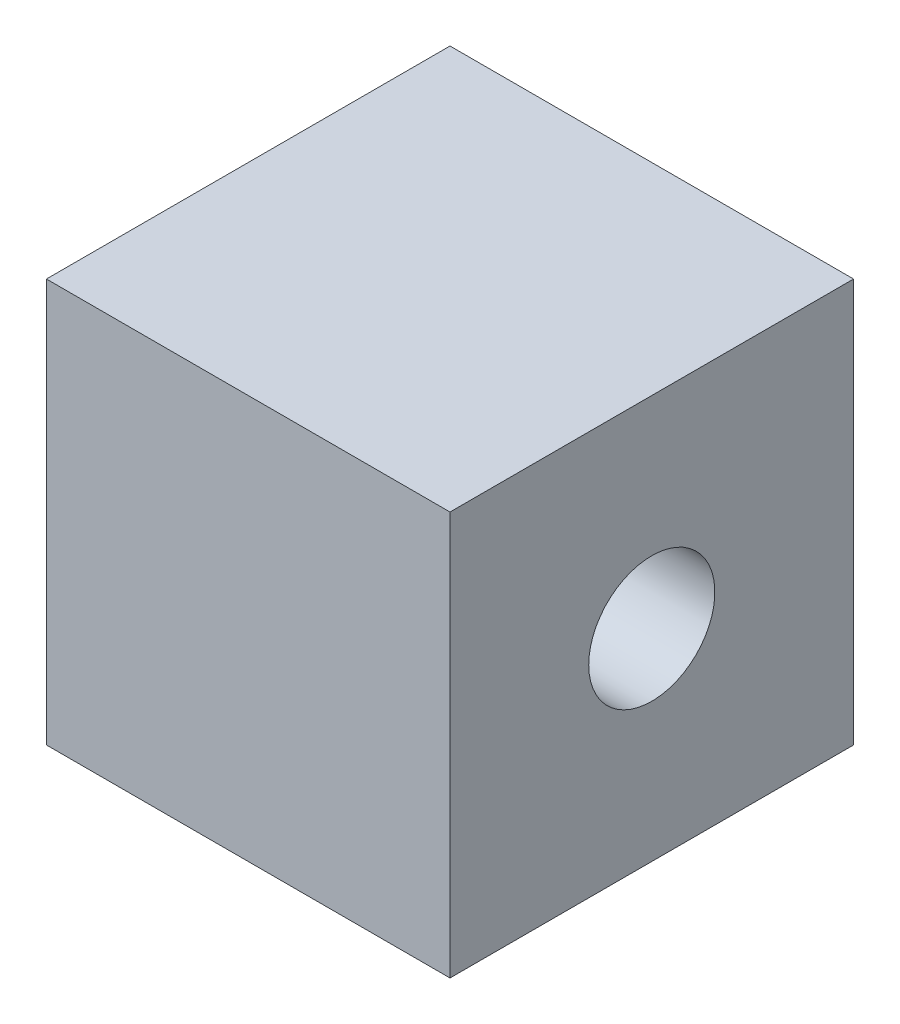
ISO-10303-21;
HEADER;
FILE_DESCRIPTION(('STEP AP214'),'2;1');
FILE_NAME('part.step','',(''),(''),'','','');
FILE_SCHEMA(('AUTOMOTIVE_DESIGN { 1 0 10303 214 1 1 1 1 }'));
ENDSEC;
DATA;
#1=APPLICATION_CONTEXT('core data for automotive mechanical design processes');
#2=APPLICATION_PROTOCOL_DEFINITION('international standard','automotive_design',2000,#1);
#3=PRODUCT_CONTEXT('',#1,'mechanical');
#4=PRODUCT('Part','Part','',(#3));
#5=PRODUCT_RELATED_PRODUCT_CATEGORY('part','',(#4));
#6=PRODUCT_DEFINITION_FORMATION('','',#4);
#7=PRODUCT_DEFINITION_CONTEXT('part definition',#1,'design');
#8=PRODUCT_DEFINITION('design','',#6,#7);
#9=PRODUCT_DEFINITION_SHAPE('','',#8);
#10=(LENGTH_UNIT() NAMED_UNIT(*) SI_UNIT(.MILLI.,.METRE.));
#11=(NAMED_UNIT(*) PLANE_ANGLE_UNIT() SI_UNIT($,.RADIAN.));
#12=(NAMED_UNIT(*) SI_UNIT($,.STERADIAN.) SOLID_ANGLE_UNIT());
#13=UNCERTAINTY_MEASURE_WITH_UNIT(LENGTH_MEASURE(1.E-05),#10,'distance_accuracy_value','');
#14=(GEOMETRIC_REPRESENTATION_CONTEXT(3) GLOBAL_UNCERTAINTY_ASSIGNED_CONTEXT((#13)) GLOBAL_UNIT_ASSIGNED_CONTEXT((#10,
#11,#12)) REPRESENTATION_CONTEXT('',''));
#15=CARTESIAN_POINT('',(0.,0.,0.));
#16=DIRECTION('',(0.,0.,1.));
#17=DIRECTION('',(1.,0.,0.));
#18=AXIS2_PLACEMENT_3D('',#15,#16,#17);
#19=CARTESIAN_POINT('',(0.,8.,0.));
#20=DIRECTION('',(1.,0.,0.));
#21=DIRECTION('',(0.,0.,-1.));
#22=AXIS2_PLACEMENT_3D('',#19,#20,#21);
#23=PLANE('',#22);
#24=CARTESIAN_POINT('',(0.,4.,-4.));
#25=DIRECTION('',(-1.,0.,0.));
#26=DIRECTION('',(0.,0.,1.));
#27=AXIS2_PLACEMENT_3D('',#24,#25,#26);
#28=CIRCLE('',#27,1.25);
#29=CARTESIAN_POINT('',(0.,4.,-2.75));
#30=VERTEX_POINT('',#29);
#31=EDGE_CURVE('E113',#30,#30,#28,.T.);
#32=ORIENTED_EDGE('',*,*,#31,.F.);
#33=EDGE_LOOP('',(#32));
#34=FACE_BOUND('',#33,.T.);
#35=DIRECTION('',(0.,0.,1.));
#36=VECTOR('',#35,1.);
#37=CARTESIAN_POINT('',(0.,0.,0.));
#38=LINE('',#37,#36);
#39=CARTESIAN_POINT('',(0.,0.,-8.));
#40=VERTEX_POINT('',#39);
#41=CARTESIAN_POINT('',(0.,0.,0.));
#42=VERTEX_POINT('',#41);
#43=EDGE_CURVE('E99',#40,#42,#38,.T.);
#44=ORIENTED_EDGE('',*,*,#43,.T.);
#45=DIRECTION('',(0.,-1.,0.));
#46=VECTOR('',#45,1.);
#47=CARTESIAN_POINT('',(0.,8.,0.));
#48=LINE('',#47,#46);
#49=CARTESIAN_POINT('',(0.,8.,0.));
#50=VERTEX_POINT('',#49);
#51=EDGE_CURVE('E11',#50,#42,#48,.T.);
#52=ORIENTED_EDGE('',*,*,#51,.F.);
#53=DIRECTION('',(0.,0.,1.));
#54=VECTOR('',#53,1.);
#55=CARTESIAN_POINT('',(0.,8.,0.));
#56=LINE('',#55,#54);
#57=CARTESIAN_POINT('',(0.,8.,-8.));
#58=VERTEX_POINT('',#57);
#59=EDGE_CURVE('E87',#58,#50,#56,.T.);
#60=ORIENTED_EDGE('',*,*,#59,.F.);
#61=DIRECTION('',(0.,-1.,0.));
#62=VECTOR('',#61,1.);
#63=CARTESIAN_POINT('',(0.,8.,-8.));
#64=LINE('',#63,#62);
#65=EDGE_CURVE('E95',#58,#40,#64,.T.);
#66=ORIENTED_EDGE('',*,*,#65,.T.);
#67=EDGE_LOOP('',(#44,#52,#60,#66));
#68=FACE_BOUND('',#67,.T.);
#69=ADVANCED_FACE('F36',(#34,#68),#23,.F.);
#70=CARTESIAN_POINT('',(0.,8.,0.));
#71=DIRECTION('',(0.,0.,-1.));
#72=DIRECTION('',(-1.,0.,0.));
#73=AXIS2_PLACEMENT_3D('',#70,#71,#72);
#74=PLANE('',#73);
#75=DIRECTION('',(1.,0.,0.));
#76=VECTOR('',#75,1.);
#77=CARTESIAN_POINT('',(0.,0.,0.));
#78=LINE('',#77,#76);
#79=CARTESIAN_POINT('',(8.00000000000001,0.,0.));
#80=VERTEX_POINT('',#79);
#81=EDGE_CURVE('E91',#42,#80,#78,.T.);
#82=ORIENTED_EDGE('',*,*,#81,.T.);
#83=DIRECTION('',(0.,-1.,0.));
#84=VECTOR('',#83,1.);
#85=CARTESIAN_POINT('',(8.00000000000001,8.,0.));
#86=LINE('',#85,#84);
#87=CARTESIAN_POINT('',(8.00000000000001,8.,0.));
#88=VERTEX_POINT('',#87);
#89=EDGE_CURVE('E44',#88,#80,#86,.T.);
#90=ORIENTED_EDGE('',*,*,#89,.F.);
#91=DIRECTION('',(1.,0.,0.));
#92=VECTOR('',#91,1.);
#93=CARTESIAN_POINT('',(0.,8.,0.));
#94=LINE('',#93,#92);
#95=EDGE_CURVE('E82',#50,#88,#94,.T.);
#96=ORIENTED_EDGE('',*,*,#95,.F.);
#97=ORIENTED_EDGE('',*,*,#51,.T.);
#98=EDGE_LOOP('',(#82,#90,#96,#97));
#99=FACE_BOUND('',#98,.T.);
#100=ADVANCED_FACE('F90',(#99),#74,.F.);
#101=CARTESIAN_POINT('',(8.00000000000001,8.,0.));
#102=DIRECTION('',(-1.,0.,0.));
#103=DIRECTION('',(0.,0.,1.));
#104=AXIS2_PLACEMENT_3D('',#101,#102,#103);
#105=PLANE('',#104);
#106=CARTESIAN_POINT('',(8.,4.,-4.));
#107=DIRECTION('',(-1.,0.,0.));
#108=DIRECTION('',(0.,0.,1.));
#109=AXIS2_PLACEMENT_3D('',#106,#107,#108);
#110=CIRCLE('',#109,1.25);
#111=CARTESIAN_POINT('',(8.,4.,-2.75));
#112=VERTEX_POINT('',#111);
#113=EDGE_CURVE('E102',#112,#112,#110,.T.);
#114=ORIENTED_EDGE('',*,*,#113,.T.);
#115=EDGE_LOOP('',(#114));
#116=FACE_BOUND('',#115,.T.);
#117=DIRECTION('',(0.,0.,-1.));
#118=VECTOR('',#117,1.);
#119=CARTESIAN_POINT('',(8.00000000000001,0.,0.));
#120=LINE('',#119,#118);
#121=CARTESIAN_POINT('',(8.00000000000001,0.,-8.));
#122=VERTEX_POINT('',#121);
#123=EDGE_CURVE('E69',#80,#122,#120,.T.);
#124=ORIENTED_EDGE('',*,*,#123,.T.);
#125=DIRECTION('',(0.,-1.,0.));
#126=VECTOR('',#125,1.);
#127=CARTESIAN_POINT('',(8.00000000000001,8.,-8.));
#128=LINE('',#127,#126);
#129=CARTESIAN_POINT('',(8.00000000000001,8.,-8.));
#130=VERTEX_POINT('',#129);
#131=EDGE_CURVE('E92',#130,#122,#128,.T.);
#132=ORIENTED_EDGE('',*,*,#131,.F.);
#133=DIRECTION('',(0.,0.,-1.));
#134=VECTOR('',#133,1.);
#135=CARTESIAN_POINT('',(8.00000000000001,8.,0.));
#136=LINE('',#135,#134);
#137=EDGE_CURVE('E85',#88,#130,#136,.T.);
#138=ORIENTED_EDGE('',*,*,#137,.F.);
#139=ORIENTED_EDGE('',*,*,#89,.T.);
#140=EDGE_LOOP('',(#124,#132,#138,#139));
#141=FACE_BOUND('',#140,.T.);
#142=ADVANCED_FACE('F93',(#116,#141),#105,.F.);
#143=CARTESIAN_POINT('',(0.,8.,-8.));
#144=DIRECTION('',(0.,0.,1.));
#145=DIRECTION('',(1.,0.,0.));
#146=AXIS2_PLACEMENT_3D('',#143,#144,#145);
#147=PLANE('',#146);
#148=DIRECTION('',(-1.,0.,0.));
#149=VECTOR('',#148,1.);
#150=CARTESIAN_POINT('',(0.,0.,-8.));
#151=LINE('',#150,#149);
#152=EDGE_CURVE('E75',#122,#40,#151,.T.);
#153=ORIENTED_EDGE('',*,*,#152,.T.);
#154=ORIENTED_EDGE('',*,*,#65,.F.);
#155=DIRECTION('',(-1.,0.,0.));
#156=VECTOR('',#155,1.);
#157=CARTESIAN_POINT('',(0.,8.,-8.));
#158=LINE('',#157,#156);
#159=EDGE_CURVE('E52',#130,#58,#158,.T.);
#160=ORIENTED_EDGE('',*,*,#159,.F.);
#161=ORIENTED_EDGE('',*,*,#131,.T.);
#162=EDGE_LOOP('',(#153,#154,#160,#161));
#163=FACE_BOUND('',#162,.T.);
#164=ADVANCED_FACE('F107',(#163),#147,.F.);
#165=CARTESIAN_POINT('',(0.,8.,0.));
#166=DIRECTION('',(0.,-1.,0.));
#167=DIRECTION('',(0.,0.,-1.));
#168=AXIS2_PLACEMENT_3D('',#165,#166,#167);
#169=PLANE('',#168);
#170=ORIENTED_EDGE('',*,*,#59,.T.);
#171=ORIENTED_EDGE('',*,*,#95,.T.);
#172=ORIENTED_EDGE('',*,*,#137,.T.);
#173=ORIENTED_EDGE('',*,*,#159,.T.);
#174=EDGE_LOOP('',(#170,#171,#172,#173));
#175=FACE_BOUND('',#174,.T.);
#176=ADVANCED_FACE('F83',(#175),#169,.F.);
#177=CARTESIAN_POINT('',(0.,0.,0.));
#178=DIRECTION('',(0.,-1.,0.));
#179=DIRECTION('',(0.,0.,-1.));
#180=AXIS2_PLACEMENT_3D('',#177,#178,#179);
#181=PLANE('',#180);
#182=ORIENTED_EDGE('',*,*,#43,.F.);
#183=ORIENTED_EDGE('',*,*,#152,.F.);
#184=ORIENTED_EDGE('',*,*,#123,.F.);
#185=ORIENTED_EDGE('',*,*,#81,.F.);
#186=EDGE_LOOP('',(#182,#183,#184,#185));
#187=FACE_BOUND('',#186,.T.);
#188=ADVANCED_FACE('F110',(#187),#181,.T.);
#189=CARTESIAN_POINT('',(8.,4.,-4.));
#190=DIRECTION('',(-1.,0.,0.));
#191=DIRECTION('',(0.,0.,1.));
#192=AXIS2_PLACEMENT_3D('',#189,#190,#191);
#193=CYLINDRICAL_SURFACE('',#192,1.25);
#194=ORIENTED_EDGE('',*,*,#113,.F.);
#195=EDGE_LOOP('',(#194));
#196=FACE_BOUND('',#195,.T.);
#197=ORIENTED_EDGE('',*,*,#31,.T.);
#198=EDGE_LOOP('',(#197));
#199=FACE_BOUND('',#198,.T.);
#200=ADVANCED_FACE('F120',(#196,#199),#193,.F.);
#201=CLOSED_SHELL('',(#69,#100,#142,#164,#176,#188,#200));
#202=MANIFOLD_SOLID_BREP('B2',#201);
#203=ADVANCED_BREP_SHAPE_REPRESENTATION('',(#18,#202),#14);
#204=SHAPE_DEFINITION_REPRESENTATION(#9,#203);
ENDSEC;
END-ISO-10303-21;
